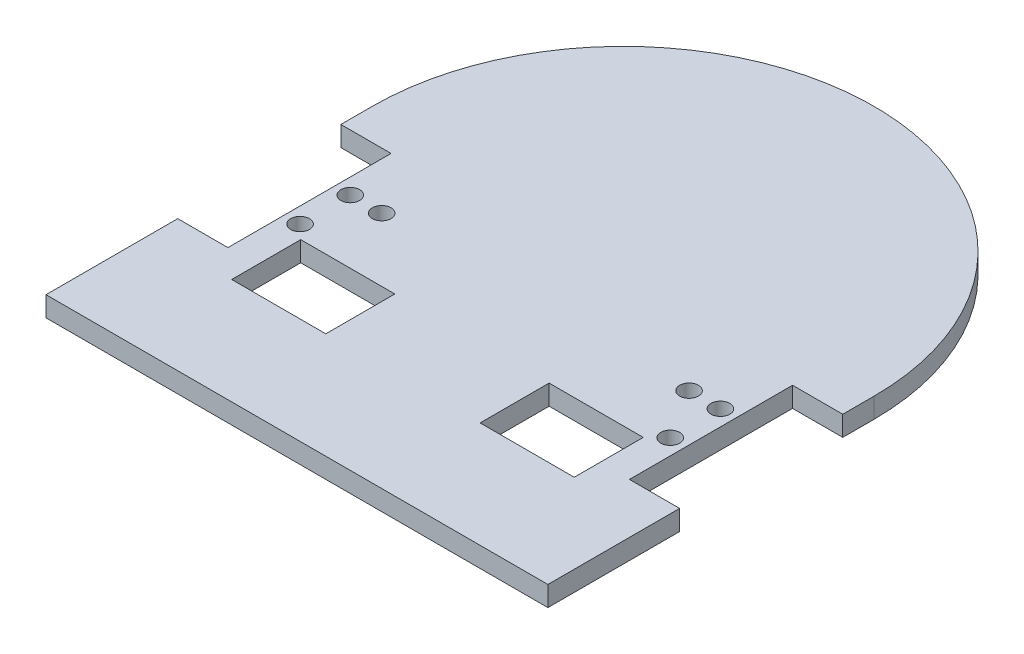
ISO-10303-21;
HEADER;
FILE_DESCRIPTION(('STEP AP214'),'2;1');
FILE_NAME('part.step','',(''),(''),'','','');
FILE_SCHEMA(('AUTOMOTIVE_DESIGN { 1 0 10303 214 1 1 1 1 }'));
ENDSEC;
DATA;
#1=APPLICATION_CONTEXT('core data for automotive mechanical design processes');
#2=APPLICATION_PROTOCOL_DEFINITION('international standard','automotive_design',2000,#1);
#3=PRODUCT_CONTEXT('',#1,'mechanical');
#4=PRODUCT('Part','Part','',(#3));
#5=PRODUCT_RELATED_PRODUCT_CATEGORY('part','',(#4));
#6=PRODUCT_DEFINITION_FORMATION('','',#4);
#7=PRODUCT_DEFINITION_CONTEXT('part definition',#1,'design');
#8=PRODUCT_DEFINITION('design','',#6,#7);
#9=PRODUCT_DEFINITION_SHAPE('','',#8);
#10=(LENGTH_UNIT() NAMED_UNIT(*) SI_UNIT(.MILLI.,.METRE.));
#11=(NAMED_UNIT(*) PLANE_ANGLE_UNIT() SI_UNIT($,.RADIAN.));
#12=(NAMED_UNIT(*) SI_UNIT($,.STERADIAN.) SOLID_ANGLE_UNIT());
#13=UNCERTAINTY_MEASURE_WITH_UNIT(LENGTH_MEASURE(1.E-05),#10,'distance_accuracy_value','');
#14=(GEOMETRIC_REPRESENTATION_CONTEXT(3) GLOBAL_UNCERTAINTY_ASSIGNED_CONTEXT((#13)) GLOBAL_UNIT_ASSIGNED_CONTEXT((#10,
#11,#12)) REPRESENTATION_CONTEXT('',''));
#15=CARTESIAN_POINT('',(0.,0.,0.));
#16=DIRECTION('',(0.,0.,1.));
#17=DIRECTION('',(1.,0.,0.));
#18=AXIS2_PLACEMENT_3D('',#15,#16,#17);
#19=CARTESIAN_POINT('',(0.,1.6,0.));
#20=DIRECTION('',(0.,1.,0.));
#21=DIRECTION('',(0.,0.,1.));
#22=AXIS2_PLACEMENT_3D('',#19,#20,#21);
#23=PLANE('',#22);
#24=CARTESIAN_POINT('',(14.75,1.6,11.));
#25=DIRECTION('',(0.,-1.,0.));
#26=DIRECTION('',(0.,0.,1.));
#27=AXIS2_PLACEMENT_3D('',#24,#25,#26);
#28=CIRCLE('',#27,0.75);
#29=CARTESIAN_POINT('',(14.75,1.6,11.75));
#30=VERTEX_POINT('',#29);
#31=EDGE_CURVE('E499',#30,#30,#28,.T.);
#32=ORIENTED_EDGE('',*,*,#31,.T.);
#33=EDGE_LOOP('',(#32));
#34=FACE_BOUND('',#33,.T.);
#35=CARTESIAN_POINT('',(12.25,1.6,7.));
#36=DIRECTION('',(0.,-1.,0.));
#37=DIRECTION('',(0.,0.,1.));
#38=AXIS2_PLACEMENT_3D('',#35,#36,#37);
#39=CIRCLE('',#38,0.75);
#40=CARTESIAN_POINT('',(12.25,1.6,7.75));
#41=VERTEX_POINT('',#40);
#42=EDGE_CURVE('E497',#41,#41,#39,.T.);
#43=ORIENTED_EDGE('',*,*,#42,.T.);
#44=EDGE_LOOP('',(#43));
#45=FACE_BOUND('',#44,.T.);
#46=CARTESIAN_POINT('',(14.75,1.6,7.));
#47=DIRECTION('',(0.,-1.,0.));
#48=DIRECTION('',(0.,0.,1.));
#49=AXIS2_PLACEMENT_3D('',#46,#47,#48);
#50=CIRCLE('',#49,0.75);
#51=CARTESIAN_POINT('',(14.75,1.6,7.75));
#52=VERTEX_POINT('',#51);
#53=EDGE_CURVE('E340',#52,#52,#50,.T.);
#54=ORIENTED_EDGE('',*,*,#53,.T.);
#55=EDGE_LOOP('',(#54));
#56=FACE_BOUND('',#55,.T.);
#57=CARTESIAN_POINT('',(-14.75,1.6,11.));
#58=DIRECTION('',(0.,1.,0.));
#59=DIRECTION('',(0.,0.,1.));
#60=AXIS2_PLACEMENT_3D('',#57,#58,#59);
#61=CIRCLE('',#60,0.75);
#62=CARTESIAN_POINT('',(-14.75,1.6,11.75));
#63=VERTEX_POINT('',#62);
#64=EDGE_CURVE('E345',#63,#63,#61,.T.);
#65=ORIENTED_EDGE('',*,*,#64,.F.);
#66=EDGE_LOOP('',(#65));
#67=FACE_BOUND('',#66,.T.);
#68=CARTESIAN_POINT('',(-12.25,1.6,7.));
#69=DIRECTION('',(0.,1.,0.));
#70=DIRECTION('',(0.,0.,1.));
#71=AXIS2_PLACEMENT_3D('',#68,#69,#70);
#72=CIRCLE('',#71,0.75);
#73=CARTESIAN_POINT('',(-12.25,1.6,7.75));
#74=VERTEX_POINT('',#73);
#75=EDGE_CURVE('E349',#74,#74,#72,.T.);
#76=ORIENTED_EDGE('',*,*,#75,.F.);
#77=EDGE_LOOP('',(#76));
#78=FACE_BOUND('',#77,.T.);
#79=CARTESIAN_POINT('',(-14.75,1.6,7.));
#80=DIRECTION('',(0.,1.,0.));
#81=DIRECTION('',(0.,0.,1.));
#82=AXIS2_PLACEMENT_3D('',#79,#80,#81);
#83=CIRCLE('',#82,0.75);
#84=CARTESIAN_POINT('',(-14.75,1.6,7.75));
#85=VERTEX_POINT('',#84);
#86=EDGE_CURVE('E331',#85,#85,#83,.T.);
#87=ORIENTED_EDGE('',*,*,#86,.F.);
#88=EDGE_LOOP('',(#87));
#89=FACE_BOUND('',#88,.T.);
#90=DIRECTION('',(1.,0.,0.));
#91=VECTOR('',#90,1.);
#92=CARTESIAN_POINT('',(-13.65,1.6,17.55));
#93=LINE('',#92,#91);
#94=CARTESIAN_POINT('',(-13.65,1.6,17.55));
#95=VERTEX_POINT('',#94);
#96=CARTESIAN_POINT('',(-6.15000000000001,1.6,17.55));
#97=VERTEX_POINT('',#96);
#98=EDGE_CURVE('E199',#95,#97,#93,.T.);
#99=ORIENTED_EDGE('',*,*,#98,.F.);
#100=DIRECTION('',(0.,0.,1.));
#101=VECTOR('',#100,1.);
#102=CARTESIAN_POINT('',(-13.65,1.6,12.05));
#103=LINE('',#102,#101);
#104=CARTESIAN_POINT('',(-13.65,1.6,12.05));
#105=VERTEX_POINT('',#104);
#106=EDGE_CURVE('E209',#105,#95,#103,.T.);
#107=ORIENTED_EDGE('',*,*,#106,.F.);
#108=DIRECTION('',(1.,0.,0.));
#109=VECTOR('',#108,1.);
#110=CARTESIAN_POINT('',(-13.65,1.6,12.05));
#111=LINE('',#110,#109);
#112=CARTESIAN_POINT('',(-6.15000000000001,1.6,12.05));
#113=VERTEX_POINT('',#112);
#114=EDGE_CURVE('E206',#105,#113,#111,.T.);
#115=ORIENTED_EDGE('',*,*,#114,.T.);
#116=DIRECTION('',(0.,0.,1.));
#117=VECTOR('',#116,1.);
#118=CARTESIAN_POINT('',(-6.15000000000001,1.6,12.05));
#119=LINE('',#118,#117);
#120=EDGE_CURVE('E203',#113,#97,#119,.T.);
#121=ORIENTED_EDGE('',*,*,#120,.T.);
#122=EDGE_LOOP('',(#99,#107,#115,#121));
#123=FACE_BOUND('',#122,.T.);
#124=DIRECTION('',(0.,0.,1.));
#125=VECTOR('',#124,1.);
#126=CARTESIAN_POINT('',(-20.,1.6,0.));
#127=LINE('',#126,#125);
#128=CARTESIAN_POINT('',(-20.,1.6,0.));
#129=VERTEX_POINT('',#128);
#130=CARTESIAN_POINT('',(-20.,1.6,2.5));
#131=VERTEX_POINT('',#130);
#132=EDGE_CURVE('E266',#129,#131,#127,.T.);
#133=ORIENTED_EDGE('',*,*,#132,.T.);
#134=DIRECTION('',(1.,0.,0.));
#135=VECTOR('',#134,1.);
#136=CARTESIAN_POINT('',(0.,1.6,2.50000000000001));
#137=LINE('',#136,#135);
#138=CARTESIAN_POINT('',(-16.,1.6,2.5));
#139=VERTEX_POINT('',#138);
#140=EDGE_CURVE('E255',#131,#139,#137,.T.);
#141=ORIENTED_EDGE('',*,*,#140,.T.);
#142=DIRECTION('',(0.,0.,1.));
#143=VECTOR('',#142,1.);
#144=CARTESIAN_POINT('',(-16.,1.6,0.));
#145=LINE('',#144,#143);
#146=CARTESIAN_POINT('',(-16.,1.6,15.5));
#147=VERTEX_POINT('',#146);
#148=EDGE_CURVE('E252',#139,#147,#145,.T.);
#149=ORIENTED_EDGE('',*,*,#148,.T.);
#150=DIRECTION('',(-1.,0.,0.));
#151=VECTOR('',#150,1.);
#152=CARTESIAN_POINT('',(0.,1.6,15.5));
#153=LINE('',#152,#151);
#154=CARTESIAN_POINT('',(-20.,1.6,15.5));
#155=VERTEX_POINT('',#154);
#156=EDGE_CURVE('E249',#147,#155,#153,.T.);
#157=ORIENTED_EDGE('',*,*,#156,.T.);
#158=CARTESIAN_POINT('',(-20.,1.6,26.));
#159=VERTEX_POINT('',#158);
#160=EDGE_CURVE('E265',#155,#159,#127,.T.);
#161=ORIENTED_EDGE('',*,*,#160,.T.);
#162=DIRECTION('',(1.,0.,0.));
#163=VECTOR('',#162,1.);
#164=CARTESIAN_POINT('',(0.,1.6,26.));
#165=LINE('',#164,#163);
#166=CARTESIAN_POINT('',(20.,1.6,26.));
#167=VERTEX_POINT('',#166);
#168=EDGE_CURVE('E269',#159,#167,#165,.T.);
#169=ORIENTED_EDGE('',*,*,#168,.T.);
#170=DIRECTION('',(0.,0.,1.));
#171=VECTOR('',#170,1.);
#172=CARTESIAN_POINT('',(20.,1.6,0.));
#173=LINE('',#172,#171);
#174=CARTESIAN_POINT('',(20.,1.6,15.5));
#175=VERTEX_POINT('',#174);
#176=EDGE_CURVE('E263',#175,#167,#173,.T.);
#177=ORIENTED_EDGE('',*,*,#176,.F.);
#178=DIRECTION('',(1.,0.,0.));
#179=VECTOR('',#178,1.);
#180=CARTESIAN_POINT('',(0.,1.6,15.5));
#181=LINE('',#180,#179);
#182=CARTESIAN_POINT('',(16.,1.6,15.5));
#183=VERTEX_POINT('',#182);
#184=EDGE_CURVE('E247',#183,#175,#181,.T.);
#185=ORIENTED_EDGE('',*,*,#184,.F.);
#186=DIRECTION('',(0.,0.,1.));
#187=VECTOR('',#186,1.);
#188=CARTESIAN_POINT('',(16.,1.6,0.));
#189=LINE('',#188,#187);
#190=CARTESIAN_POINT('',(16.,1.6,2.5));
#191=VERTEX_POINT('',#190);
#192=EDGE_CURVE('E245',#191,#183,#189,.T.);
#193=ORIENTED_EDGE('',*,*,#192,.F.);
#194=DIRECTION('',(-1.,0.,0.));
#195=VECTOR('',#194,1.);
#196=CARTESIAN_POINT('',(0.,1.6,2.50000000000001));
#197=LINE('',#196,#195);
#198=CARTESIAN_POINT('',(20.,1.6,2.5));
#199=VERTEX_POINT('',#198);
#200=EDGE_CURVE('E225',#199,#191,#197,.T.);
#201=ORIENTED_EDGE('',*,*,#200,.F.);
#202=CARTESIAN_POINT('',(20.,1.6,0.));
#203=VERTEX_POINT('',#202);
#204=EDGE_CURVE('E259',#203,#199,#173,.T.);
#205=ORIENTED_EDGE('',*,*,#204,.F.);
#206=CARTESIAN_POINT('',(0.,1.6,0.));
#207=DIRECTION('',(0.,1.,0.));
#208=DIRECTION('',(0.,0.,1.));
#209=AXIS2_PLACEMENT_3D('',#206,#207,#208);
#210=CIRCLE('',#209,20.);
#211=EDGE_CURVE('E262',#203,#129,#210,.T.);
#212=ORIENTED_EDGE('',*,*,#211,.T.);
#213=EDGE_LOOP('',(#133,#141,#149,#157,#161,#169,#177,#185,#193,#201,#205,#212));
#214=FACE_BOUND('',#213,.T.);
#215=DIRECTION('',(0.,0.,1.));
#216=VECTOR('',#215,1.);
#217=CARTESIAN_POINT('',(13.65,1.6,12.05));
#218=LINE('',#217,#216);
#219=CARTESIAN_POINT('',(13.65,1.6,12.05));
#220=VERTEX_POINT('',#219);
#221=CARTESIAN_POINT('',(13.65,1.6,17.55));
#222=VERTEX_POINT('',#221);
#223=EDGE_CURVE('E187',#220,#222,#218,.T.);
#224=ORIENTED_EDGE('',*,*,#223,.T.);
#225=DIRECTION('',(-1.,0.,0.));
#226=VECTOR('',#225,1.);
#227=CARTESIAN_POINT('',(13.65,1.6,17.55));
#228=LINE('',#227,#226);
#229=CARTESIAN_POINT('',(6.15000000000001,1.6,17.55));
#230=VERTEX_POINT('',#229);
#231=EDGE_CURVE('E54',#222,#230,#228,.T.);
#232=ORIENTED_EDGE('',*,*,#231,.T.);
#233=DIRECTION('',(0.,0.,1.));
#234=VECTOR('',#233,1.);
#235=CARTESIAN_POINT('',(6.15000000000001,1.6,12.05));
#236=LINE('',#235,#234);
#237=CARTESIAN_POINT('',(6.15000000000001,1.6,12.05));
#238=VERTEX_POINT('',#237);
#239=EDGE_CURVE('E192',#238,#230,#236,.T.);
#240=ORIENTED_EDGE('',*,*,#239,.F.);
#241=DIRECTION('',(-1.,0.,0.));
#242=VECTOR('',#241,1.);
#243=CARTESIAN_POINT('',(13.65,1.6,12.05));
#244=LINE('',#243,#242);
#245=EDGE_CURVE('E178',#220,#238,#244,.T.);
#246=ORIENTED_EDGE('',*,*,#245,.F.);
#247=EDGE_LOOP('',(#224,#232,#240,#246));
#248=FACE_BOUND('',#247,.T.);
#249=ADVANCED_FACE('F37',(#34,#45,#56,#67,#78,#89,#123,#214,#248),#23,.T.);
#250=CARTESIAN_POINT('',(0.,0.,0.));
#251=DIRECTION('',(0.,1.,0.));
#252=DIRECTION('',(0.,0.,1.));
#253=AXIS2_PLACEMENT_3D('',#250,#251,#252);
#254=PLANE('',#253);
#255=CARTESIAN_POINT('',(14.75,0.,11.));
#256=DIRECTION('',(0.,1.,0.));
#257=DIRECTION('',(0.,0.,1.));
#258=AXIS2_PLACEMENT_3D('',#255,#256,#257);
#259=CIRCLE('',#258,0.75);
#260=CARTESIAN_POINT('',(14.75,0.,11.75));
#261=VERTEX_POINT('',#260);
#262=EDGE_CURVE('E41',#261,#261,#259,.F.);
#263=ORIENTED_EDGE('',*,*,#262,.F.);
#264=EDGE_LOOP('',(#263));
#265=FACE_BOUND('',#264,.T.);
#266=CARTESIAN_POINT('',(12.25,0.,7.));
#267=DIRECTION('',(0.,1.,0.));
#268=DIRECTION('',(0.,0.,1.));
#269=AXIS2_PLACEMENT_3D('',#266,#267,#268);
#270=CIRCLE('',#269,0.75);
#271=CARTESIAN_POINT('',(12.25,0.,7.75));
#272=VERTEX_POINT('',#271);
#273=EDGE_CURVE('E339',#272,#272,#270,.F.);
#274=ORIENTED_EDGE('',*,*,#273,.F.);
#275=EDGE_LOOP('',(#274));
#276=FACE_BOUND('',#275,.T.);
#277=CARTESIAN_POINT('',(14.75,0.,7.));
#278=DIRECTION('',(0.,1.,0.));
#279=DIRECTION('',(0.,0.,1.));
#280=AXIS2_PLACEMENT_3D('',#277,#278,#279);
#281=CIRCLE('',#280,0.75);
#282=CARTESIAN_POINT('',(14.75,0.,7.75));
#283=VERTEX_POINT('',#282);
#284=EDGE_CURVE('E337',#283,#283,#281,.F.);
#285=ORIENTED_EDGE('',*,*,#284,.F.);
#286=EDGE_LOOP('',(#285));
#287=FACE_BOUND('',#286,.T.);
#288=CARTESIAN_POINT('',(-14.75,0.,11.));
#289=DIRECTION('',(0.,1.,0.));
#290=DIRECTION('',(0.,0.,1.));
#291=AXIS2_PLACEMENT_3D('',#288,#289,#290);
#292=CIRCLE('',#291,0.75);
#293=CARTESIAN_POINT('',(-14.75,0.,11.75));
#294=VERTEX_POINT('',#293);
#295=EDGE_CURVE('E334',#294,#294,#292,.T.);
#296=ORIENTED_EDGE('',*,*,#295,.T.);
#297=EDGE_LOOP('',(#296));
#298=FACE_BOUND('',#297,.T.);
#299=CARTESIAN_POINT('',(-12.25,0.,7.));
#300=DIRECTION('',(0.,1.,0.));
#301=DIRECTION('',(0.,0.,1.));
#302=AXIS2_PLACEMENT_3D('',#299,#300,#301);
#303=CIRCLE('',#302,0.75);
#304=CARTESIAN_POINT('',(-12.25,0.,7.75));
#305=VERTEX_POINT('',#304);
#306=EDGE_CURVE('E330',#305,#305,#303,.T.);
#307=ORIENTED_EDGE('',*,*,#306,.T.);
#308=EDGE_LOOP('',(#307));
#309=FACE_BOUND('',#308,.T.);
#310=CARTESIAN_POINT('',(-14.75,0.,7.));
#311=DIRECTION('',(0.,1.,0.));
#312=DIRECTION('',(0.,0.,1.));
#313=AXIS2_PLACEMENT_3D('',#310,#311,#312);
#314=CIRCLE('',#313,0.75);
#315=CARTESIAN_POINT('',(-14.75,0.,7.75));
#316=VERTEX_POINT('',#315);
#317=EDGE_CURVE('E327',#316,#316,#314,.T.);
#318=ORIENTED_EDGE('',*,*,#317,.T.);
#319=EDGE_LOOP('',(#318));
#320=FACE_BOUND('',#319,.T.);
#321=DIRECTION('',(1.,0.,0.));
#322=VECTOR('',#321,1.);
#323=CARTESIAN_POINT('',(0.,0.,2.50000000000001));
#324=LINE('',#323,#322);
#325=CARTESIAN_POINT('',(-20.,0.,2.5));
#326=VERTEX_POINT('',#325);
#327=CARTESIAN_POINT('',(-16.,0.,2.5));
#328=VERTEX_POINT('',#327);
#329=EDGE_CURVE('E309',#326,#328,#324,.T.);
#330=ORIENTED_EDGE('',*,*,#329,.F.);
#331=DIRECTION('',(0.,0.,1.));
#332=VECTOR('',#331,1.);
#333=CARTESIAN_POINT('',(-20.,0.,0.));
#334=LINE('',#333,#332);
#335=CARTESIAN_POINT('',(-20.,0.,0.));
#336=VERTEX_POINT('',#335);
#337=EDGE_CURVE('E279',#336,#326,#334,.T.);
#338=ORIENTED_EDGE('',*,*,#337,.F.);
#339=CARTESIAN_POINT('',(0.,0.,0.));
#340=DIRECTION('',(0.,1.,0.));
#341=DIRECTION('',(0.,0.,1.));
#342=AXIS2_PLACEMENT_3D('',#339,#340,#341);
#343=CIRCLE('',#342,20.);
#344=CARTESIAN_POINT('',(20.,0.,0.));
#345=VERTEX_POINT('',#344);
#346=EDGE_CURVE('E276',#345,#336,#343,.T.);
#347=ORIENTED_EDGE('',*,*,#346,.F.);
#348=DIRECTION('',(0.,0.,1.));
#349=VECTOR('',#348,1.);
#350=CARTESIAN_POINT('',(20.,0.,0.));
#351=LINE('',#350,#349);
#352=CARTESIAN_POINT('',(20.,0.,2.5));
#353=VERTEX_POINT('',#352);
#354=EDGE_CURVE('E273',#345,#353,#351,.T.);
#355=ORIENTED_EDGE('',*,*,#354,.T.);
#356=DIRECTION('',(-1.,0.,0.));
#357=VECTOR('',#356,1.);
#358=CARTESIAN_POINT('',(0.,0.,2.50000000000001));
#359=LINE('',#358,#357);
#360=CARTESIAN_POINT('',(16.,0.,2.5));
#361=VERTEX_POINT('',#360);
#362=EDGE_CURVE('E295',#353,#361,#359,.T.);
#363=ORIENTED_EDGE('',*,*,#362,.T.);
#364=DIRECTION('',(0.,0.,1.));
#365=VECTOR('',#364,1.);
#366=CARTESIAN_POINT('',(16.,0.,0.));
#367=LINE('',#366,#365);
#368=CARTESIAN_POINT('',(16.,0.,15.5));
#369=VERTEX_POINT('',#368);
#370=EDGE_CURVE('E298',#361,#369,#367,.T.);
#371=ORIENTED_EDGE('',*,*,#370,.T.);
#372=DIRECTION('',(1.,0.,0.));
#373=VECTOR('',#372,1.);
#374=CARTESIAN_POINT('',(0.,0.,15.5));
#375=LINE('',#374,#373);
#376=CARTESIAN_POINT('',(20.,0.,15.5));
#377=VERTEX_POINT('',#376);
#378=EDGE_CURVE('E301',#369,#377,#375,.T.);
#379=ORIENTED_EDGE('',*,*,#378,.T.);
#380=CARTESIAN_POINT('',(20.,0.,26.));
#381=VERTEX_POINT('',#380);
#382=EDGE_CURVE('E258',#377,#381,#351,.T.);
#383=ORIENTED_EDGE('',*,*,#382,.T.);
#384=DIRECTION('',(1.,0.,0.));
#385=VECTOR('',#384,1.);
#386=CARTESIAN_POINT('',(0.,0.,26.));
#387=LINE('',#386,#385);
#388=CARTESIAN_POINT('',(-20.,0.,26.));
#389=VERTEX_POINT('',#388);
#390=EDGE_CURVE('E282',#389,#381,#387,.T.);
#391=ORIENTED_EDGE('',*,*,#390,.F.);
#392=CARTESIAN_POINT('',(-20.,0.,15.5));
#393=VERTEX_POINT('',#392);
#394=EDGE_CURVE('E278',#393,#389,#334,.T.);
#395=ORIENTED_EDGE('',*,*,#394,.F.);
#396=DIRECTION('',(-1.,0.,0.));
#397=VECTOR('',#396,1.);
#398=CARTESIAN_POINT('',(0.,0.,15.5));
#399=LINE('',#398,#397);
#400=CARTESIAN_POINT('',(-16.,0.,15.5));
#401=VERTEX_POINT('',#400);
#402=EDGE_CURVE('E304',#401,#393,#399,.T.);
#403=ORIENTED_EDGE('',*,*,#402,.F.);
#404=DIRECTION('',(0.,0.,1.));
#405=VECTOR('',#404,1.);
#406=CARTESIAN_POINT('',(-16.,0.,0.));
#407=LINE('',#406,#405);
#408=EDGE_CURVE('E306',#328,#401,#407,.T.);
#409=ORIENTED_EDGE('',*,*,#408,.F.);
#410=EDGE_LOOP('',(#330,#338,#347,#355,#363,#371,#379,#383,#391,#395,#403,#409));
#411=FACE_BOUND('',#410,.T.);
#412=DIRECTION('',(0.,0.,1.));
#413=VECTOR('',#412,1.);
#414=CARTESIAN_POINT('',(-13.65,0.,0.));
#415=LINE('',#414,#413);
#416=CARTESIAN_POINT('',(-13.65,0.,12.05));
#417=VERTEX_POINT('',#416);
#418=CARTESIAN_POINT('',(-13.65,0.,17.55));
#419=VERTEX_POINT('',#418);
#420=EDGE_CURVE('E316',#417,#419,#415,.T.);
#421=ORIENTED_EDGE('',*,*,#420,.T.);
#422=DIRECTION('',(1.,0.,0.));
#423=VECTOR('',#422,1.);
#424=CARTESIAN_POINT('',(0.,0.,17.55));
#425=LINE('',#424,#423);
#426=CARTESIAN_POINT('',(-6.15000000000001,0.,17.55));
#427=VERTEX_POINT('',#426);
#428=EDGE_CURVE('E319',#419,#427,#425,.T.);
#429=ORIENTED_EDGE('',*,*,#428,.T.);
#430=DIRECTION('',(0.,0.,1.));
#431=VECTOR('',#430,1.);
#432=CARTESIAN_POINT('',(-6.15000000000001,0.,0.));
#433=LINE('',#432,#431);
#434=CARTESIAN_POINT('',(-6.15000000000001,0.,12.05));
#435=VERTEX_POINT('',#434);
#436=EDGE_CURVE('E311',#435,#427,#433,.T.);
#437=ORIENTED_EDGE('',*,*,#436,.F.);
#438=DIRECTION('',(1.,0.,0.));
#439=VECTOR('',#438,1.);
#440=CARTESIAN_POINT('',(0.,0.,12.05));
#441=LINE('',#440,#439);
#442=EDGE_CURVE('E313',#417,#435,#441,.T.);
#443=ORIENTED_EDGE('',*,*,#442,.F.);
#444=EDGE_LOOP('',(#421,#429,#437,#443));
#445=FACE_BOUND('',#444,.T.);
#446=DIRECTION('',(-1.,0.,0.));
#447=VECTOR('',#446,1.);
#448=CARTESIAN_POINT('',(0.,0.,17.55));
#449=LINE('',#448,#447);
#450=CARTESIAN_POINT('',(13.65,0.,17.55));
#451=VERTEX_POINT('',#450);
#452=CARTESIAN_POINT('',(6.15000000000001,0.,17.55));
#453=VERTEX_POINT('',#452);
#454=EDGE_CURVE('E11',#451,#453,#449,.T.);
#455=ORIENTED_EDGE('',*,*,#454,.F.);
#456=DIRECTION('',(0.,0.,1.));
#457=VECTOR('',#456,1.);
#458=CARTESIAN_POINT('',(13.65,0.,0.));
#459=LINE('',#458,#457);
#460=CARTESIAN_POINT('',(13.65,0.,12.05));
#461=VERTEX_POINT('',#460);
#462=EDGE_CURVE('E322',#461,#451,#459,.T.);
#463=ORIENTED_EDGE('',*,*,#462,.F.);
#464=DIRECTION('',(-1.,0.,0.));
#465=VECTOR('',#464,1.);
#466=CARTESIAN_POINT('',(0.,0.,12.05));
#467=LINE('',#466,#465);
#468=CARTESIAN_POINT('',(6.15000000000001,0.,12.05));
#469=VERTEX_POINT('',#468);
#470=EDGE_CURVE('E181',#461,#469,#467,.T.);
#471=ORIENTED_EDGE('',*,*,#470,.T.);
#472=DIRECTION('',(0.,0.,1.));
#473=VECTOR('',#472,1.);
#474=CARTESIAN_POINT('',(6.15000000000001,0.,0.));
#475=LINE('',#474,#473);
#476=EDGE_CURVE('E46',#469,#453,#475,.T.);
#477=ORIENTED_EDGE('',*,*,#476,.T.);
#478=EDGE_LOOP('',(#455,#463,#471,#477));
#479=FACE_BOUND('',#478,.T.);
#480=ADVANCED_FACE('F365',(#265,#276,#287,#298,#309,#320,#411,#445,#479),#254,.F.);
#481=CARTESIAN_POINT('',(20.,1.6,0.));
#482=DIRECTION('',(1.,0.,0.));
#483=DIRECTION('',(0.,0.,-1.));
#484=AXIS2_PLACEMENT_3D('',#481,#482,#483);
#485=PLANE('',#484);
#486=DIRECTION('',(0.,1.,0.));
#487=VECTOR('',#486,1.);
#488=CARTESIAN_POINT('',(20.,-7.,15.5));
#489=LINE('',#488,#487);
#490=EDGE_CURVE('E215',#377,#175,#489,.T.);
#491=ORIENTED_EDGE('',*,*,#490,.T.);
#492=ORIENTED_EDGE('',*,*,#176,.T.);
#493=DIRECTION('',(0.,-1.,0.));
#494=VECTOR('',#493,1.);
#495=CARTESIAN_POINT('',(20.,1.6,26.));
#496=LINE('',#495,#494);
#497=EDGE_CURVE('E272',#167,#381,#496,.T.);
#498=ORIENTED_EDGE('',*,*,#497,.T.);
#499=ORIENTED_EDGE('',*,*,#382,.F.);
#500=EDGE_LOOP('',(#491,#492,#498,#499));
#501=FACE_BOUND('',#500,.T.);
#502=ADVANCED_FACE('F405',(#501),#485,.T.);
#503=CARTESIAN_POINT('',(-20.,1.6,0.));
#504=DIRECTION('',(1.,0.,0.));
#505=DIRECTION('',(0.,0.,-1.));
#506=AXIS2_PLACEMENT_3D('',#503,#504,#505);
#507=PLANE('',#506);
#508=DIRECTION('',(0.,1.,0.));
#509=VECTOR('',#508,1.);
#510=CARTESIAN_POINT('',(-20.,-7.,2.5));
#511=LINE('',#510,#509);
#512=EDGE_CURVE('E222',#326,#131,#511,.T.);
#513=ORIENTED_EDGE('',*,*,#512,.T.);
#514=ORIENTED_EDGE('',*,*,#132,.F.);
#515=DIRECTION('',(0.,-1.,0.));
#516=VECTOR('',#515,1.);
#517=CARTESIAN_POINT('',(-20.,1.6,0.));
#518=LINE('',#517,#516);
#519=EDGE_CURVE('E290',#129,#336,#518,.T.);
#520=ORIENTED_EDGE('',*,*,#519,.T.);
#521=ORIENTED_EDGE('',*,*,#337,.T.);
#522=EDGE_LOOP('',(#513,#514,#520,#521));
#523=FACE_BOUND('',#522,.T.);
#524=ADVANCED_FACE('F376',(#523),#507,.F.);
#525=DIRECTION('',(0.,1.,0.));
#526=VECTOR('',#525,1.);
#527=CARTESIAN_POINT('',(-20.,-7.,15.5));
#528=LINE('',#527,#526);
#529=EDGE_CURVE('E232',#393,#155,#528,.T.);
#530=ORIENTED_EDGE('',*,*,#529,.F.);
#531=ORIENTED_EDGE('',*,*,#394,.T.);
#532=DIRECTION('',(0.,-1.,0.));
#533=VECTOR('',#532,1.);
#534=CARTESIAN_POINT('',(-20.,1.6,26.));
#535=LINE('',#534,#533);
#536=EDGE_CURVE('E287',#159,#389,#535,.T.);
#537=ORIENTED_EDGE('',*,*,#536,.F.);
#538=ORIENTED_EDGE('',*,*,#160,.F.);
#539=EDGE_LOOP('',(#530,#531,#537,#538));
#540=FACE_BOUND('',#539,.T.);
#541=ADVANCED_FACE('F395',(#540),#507,.F.);
#542=DIRECTION('',(0.,1.,0.));
#543=VECTOR('',#542,1.);
#544=CARTESIAN_POINT('',(20.,-7.,2.5));
#545=LINE('',#544,#543);
#546=EDGE_CURVE('E240',#353,#199,#545,.T.);
#547=ORIENTED_EDGE('',*,*,#546,.F.);
#548=ORIENTED_EDGE('',*,*,#354,.F.);
#549=DIRECTION('',(0.,-1.,0.));
#550=VECTOR('',#549,1.);
#551=CARTESIAN_POINT('',(20.,1.6,0.));
#552=LINE('',#551,#550);
#553=EDGE_CURVE('E293',#203,#345,#552,.T.);
#554=ORIENTED_EDGE('',*,*,#553,.F.);
#555=ORIENTED_EDGE('',*,*,#204,.T.);
#556=EDGE_LOOP('',(#547,#548,#554,#555));
#557=FACE_BOUND('',#556,.T.);
#558=ADVANCED_FACE('F39',(#557),#485,.T.);
#559=CARTESIAN_POINT('',(0.,1.6,0.));
#560=DIRECTION('',(0.,-1.,0.));
#561=DIRECTION('',(0.,0.,-1.));
#562=AXIS2_PLACEMENT_3D('',#559,#560,#561);
#563=CYLINDRICAL_SURFACE('',#562,20.);
#564=ORIENTED_EDGE('',*,*,#346,.T.);
#565=ORIENTED_EDGE('',*,*,#519,.F.);
#566=ORIENTED_EDGE('',*,*,#211,.F.);
#567=ORIENTED_EDGE('',*,*,#553,.T.);
#568=EDGE_LOOP('',(#564,#565,#566,#567));
#569=FACE_BOUND('',#568,.T.);
#570=ADVANCED_FACE('F419',(#569),#563,.T.);
#571=CARTESIAN_POINT('',(0.,1.6,26.));
#572=DIRECTION('',(0.,0.,-1.));
#573=DIRECTION('',(-1.,0.,0.));
#574=AXIS2_PLACEMENT_3D('',#571,#572,#573);
#575=PLANE('',#574);
#576=ORIENTED_EDGE('',*,*,#390,.T.);
#577=ORIENTED_EDGE('',*,*,#497,.F.);
#578=ORIENTED_EDGE('',*,*,#168,.F.);
#579=ORIENTED_EDGE('',*,*,#536,.T.);
#580=EDGE_LOOP('',(#576,#577,#578,#579));
#581=FACE_BOUND('',#580,.T.);
#582=ADVANCED_FACE('F400',(#581),#575,.F.);
#583=CARTESIAN_POINT('',(0.,-7.,15.5));
#584=DIRECTION('',(0.,0.,1.));
#585=DIRECTION('',(1.,0.,0.));
#586=AXIS2_PLACEMENT_3D('',#583,#584,#585);
#587=PLANE('',#586);
#588=ORIENTED_EDGE('',*,*,#184,.T.);
#589=ORIENTED_EDGE('',*,*,#490,.F.);
#590=ORIENTED_EDGE('',*,*,#378,.F.);
#591=DIRECTION('',(0.,1.,0.));
#592=VECTOR('',#591,1.);
#593=CARTESIAN_POINT('',(16.,-7.,15.5));
#594=LINE('',#593,#592);
#595=EDGE_CURVE('E234',#369,#183,#594,.T.);
#596=ORIENTED_EDGE('',*,*,#595,.T.);
#597=EDGE_LOOP('',(#588,#589,#590,#596));
#598=FACE_BOUND('',#597,.T.);
#599=ADVANCED_FACE('F408',(#598),#587,.F.);
#600=CARTESIAN_POINT('',(16.,-7.,0.));
#601=DIRECTION('',(-1.,0.,0.));
#602=DIRECTION('',(0.,0.,1.));
#603=AXIS2_PLACEMENT_3D('',#600,#601,#602);
#604=PLANE('',#603);
#605=ORIENTED_EDGE('',*,*,#192,.T.);
#606=ORIENTED_EDGE('',*,*,#595,.F.);
#607=ORIENTED_EDGE('',*,*,#370,.F.);
#608=DIRECTION('',(0.,1.,0.));
#609=VECTOR('',#608,1.);
#610=CARTESIAN_POINT('',(16.,-7.,2.5));
#611=LINE('',#610,#609);
#612=EDGE_CURVE('E237',#361,#191,#611,.T.);
#613=ORIENTED_EDGE('',*,*,#612,.T.);
#614=EDGE_LOOP('',(#605,#606,#607,#613));
#615=FACE_BOUND('',#614,.T.);
#616=ADVANCED_FACE('F412',(#615),#604,.F.);
#617=CARTESIAN_POINT('',(0.,-7.,2.50000000000001));
#618=DIRECTION('',(0.,0.,-1.));
#619=DIRECTION('',(-1.,0.,0.));
#620=AXIS2_PLACEMENT_3D('',#617,#618,#619);
#621=PLANE('',#620);
#622=ORIENTED_EDGE('',*,*,#200,.T.);
#623=ORIENTED_EDGE('',*,*,#612,.F.);
#624=ORIENTED_EDGE('',*,*,#362,.F.);
#625=ORIENTED_EDGE('',*,*,#546,.T.);
#626=EDGE_LOOP('',(#622,#623,#624,#625));
#627=FACE_BOUND('',#626,.T.);
#628=ADVANCED_FACE('F434',(#627),#621,.F.);
#629=CARTESIAN_POINT('',(0.,-7.,2.50000000000001));
#630=DIRECTION('',(0.,0.,1.));
#631=DIRECTION('',(1.,0.,0.));
#632=AXIS2_PLACEMENT_3D('',#629,#630,#631);
#633=PLANE('',#632);
#634=ORIENTED_EDGE('',*,*,#512,.F.);
#635=ORIENTED_EDGE('',*,*,#329,.T.);
#636=DIRECTION('',(0.,1.,0.));
#637=VECTOR('',#636,1.);
#638=CARTESIAN_POINT('',(-16.,-7.,2.5));
#639=LINE('',#638,#637);
#640=EDGE_CURVE('E226',#328,#139,#639,.T.);
#641=ORIENTED_EDGE('',*,*,#640,.T.);
#642=ORIENTED_EDGE('',*,*,#140,.F.);
#643=EDGE_LOOP('',(#634,#635,#641,#642));
#644=FACE_BOUND('',#643,.T.);
#645=ADVANCED_FACE('F380',(#644),#633,.T.);
#646=CARTESIAN_POINT('',(-16.,-7.,0.));
#647=DIRECTION('',(-1.,0.,0.));
#648=DIRECTION('',(0.,0.,1.));
#649=AXIS2_PLACEMENT_3D('',#646,#647,#648);
#650=PLANE('',#649);
#651=ORIENTED_EDGE('',*,*,#640,.F.);
#652=ORIENTED_EDGE('',*,*,#408,.T.);
#653=DIRECTION('',(0.,1.,0.));
#654=VECTOR('',#653,1.);
#655=CARTESIAN_POINT('',(-16.,-7.,15.5));
#656=LINE('',#655,#654);
#657=EDGE_CURVE('E229',#401,#147,#656,.T.);
#658=ORIENTED_EDGE('',*,*,#657,.T.);
#659=ORIENTED_EDGE('',*,*,#148,.F.);
#660=EDGE_LOOP('',(#651,#652,#658,#659));
#661=FACE_BOUND('',#660,.T.);
#662=ADVANCED_FACE('F389',(#661),#650,.T.);
#663=CARTESIAN_POINT('',(0.,-7.,15.5));
#664=DIRECTION('',(0.,0.,-1.));
#665=DIRECTION('',(-1.,0.,0.));
#666=AXIS2_PLACEMENT_3D('',#663,#664,#665);
#667=PLANE('',#666);
#668=ORIENTED_EDGE('',*,*,#657,.F.);
#669=ORIENTED_EDGE('',*,*,#402,.T.);
#670=ORIENTED_EDGE('',*,*,#529,.T.);
#671=ORIENTED_EDGE('',*,*,#156,.F.);
#672=EDGE_LOOP('',(#668,#669,#670,#671));
#673=FACE_BOUND('',#672,.T.);
#674=ADVANCED_FACE('F439',(#673),#667,.T.);
#675=CARTESIAN_POINT('',(-13.65,-8.4,17.55));
#676=DIRECTION('',(0.,0.,1.));
#677=DIRECTION('',(1.,0.,0.));
#678=AXIS2_PLACEMENT_3D('',#675,#676,#677);
#679=PLANE('',#678);
#680=DIRECTION('',(0.,1.,0.));
#681=VECTOR('',#680,1.);
#682=CARTESIAN_POINT('',(-13.65,-8.4,17.55));
#683=LINE('',#682,#681);
#684=EDGE_CURVE('E213',#419,#95,#683,.T.);
#685=ORIENTED_EDGE('',*,*,#684,.T.);
#686=ORIENTED_EDGE('',*,*,#98,.T.);
#687=DIRECTION('',(0.,1.,0.));
#688=VECTOR('',#687,1.);
#689=CARTESIAN_POINT('',(-6.15000000000001,-8.4,17.55));
#690=LINE('',#689,#688);
#691=EDGE_CURVE('E212',#427,#97,#690,.T.);
#692=ORIENTED_EDGE('',*,*,#691,.F.);
#693=ORIENTED_EDGE('',*,*,#428,.F.);
#694=EDGE_LOOP('',(#685,#686,#692,#693));
#695=FACE_BOUND('',#694,.T.);
#696=ADVANCED_FACE('F442',(#695),#679,.F.);
#697=CARTESIAN_POINT('',(-13.65,-8.4,12.05));
#698=DIRECTION('',(-1.,0.,0.));
#699=DIRECTION('',(0.,0.,1.));
#700=AXIS2_PLACEMENT_3D('',#697,#698,#699);
#701=PLANE('',#700);
#702=DIRECTION('',(0.,1.,0.));
#703=VECTOR('',#702,1.);
#704=CARTESIAN_POINT('',(-13.65,-8.4,12.05));
#705=LINE('',#704,#703);
#706=EDGE_CURVE('E216',#417,#105,#705,.T.);
#707=ORIENTED_EDGE('',*,*,#706,.T.);
#708=ORIENTED_EDGE('',*,*,#106,.T.);
#709=ORIENTED_EDGE('',*,*,#684,.F.);
#710=ORIENTED_EDGE('',*,*,#420,.F.);
#711=EDGE_LOOP('',(#707,#708,#709,#710));
#712=FACE_BOUND('',#711,.T.);
#713=ADVANCED_FACE('F449',(#712),#701,.F.);
#714=CARTESIAN_POINT('',(-13.65,-8.4,12.05));
#715=DIRECTION('',(0.,0.,1.));
#716=DIRECTION('',(1.,0.,0.));
#717=AXIS2_PLACEMENT_3D('',#714,#715,#716);
#718=PLANE('',#717);
#719=ORIENTED_EDGE('',*,*,#442,.T.);
#720=DIRECTION('',(0.,1.,0.));
#721=VECTOR('',#720,1.);
#722=CARTESIAN_POINT('',(-6.15000000000001,-8.4,12.05));
#723=LINE('',#722,#721);
#724=EDGE_CURVE('E218',#435,#113,#723,.T.);
#725=ORIENTED_EDGE('',*,*,#724,.T.);
#726=ORIENTED_EDGE('',*,*,#114,.F.);
#727=ORIENTED_EDGE('',*,*,#706,.F.);
#728=EDGE_LOOP('',(#719,#725,#726,#727));
#729=FACE_BOUND('',#728,.T.);
#730=ADVANCED_FACE('F455',(#729),#718,.T.);
#731=CARTESIAN_POINT('',(-6.15000000000001,-8.4,12.05));
#732=DIRECTION('',(-1.,0.,0.));
#733=DIRECTION('',(0.,0.,1.));
#734=AXIS2_PLACEMENT_3D('',#731,#732,#733);
#735=PLANE('',#734);
#736=ORIENTED_EDGE('',*,*,#436,.T.);
#737=ORIENTED_EDGE('',*,*,#691,.T.);
#738=ORIENTED_EDGE('',*,*,#120,.F.);
#739=ORIENTED_EDGE('',*,*,#724,.F.);
#740=EDGE_LOOP('',(#736,#737,#738,#739));
#741=FACE_BOUND('',#740,.T.);
#742=ADVANCED_FACE('F451',(#741),#735,.T.);
#743=CARTESIAN_POINT('',(13.65,-8.4,17.55));
#744=DIRECTION('',(0.,0.,-1.));
#745=DIRECTION('',(-1.,0.,0.));
#746=AXIS2_PLACEMENT_3D('',#743,#744,#745);
#747=PLANE('',#746);
#748=ORIENTED_EDGE('',*,*,#454,.T.);
#749=DIRECTION('',(0.,1.,0.));
#750=VECTOR('',#749,1.);
#751=CARTESIAN_POINT('',(6.15000000000001,-8.4,17.55));
#752=LINE('',#751,#750);
#753=EDGE_CURVE('E197',#453,#230,#752,.T.);
#754=ORIENTED_EDGE('',*,*,#753,.T.);
#755=ORIENTED_EDGE('',*,*,#231,.F.);
#756=DIRECTION('',(0.,1.,0.));
#757=VECTOR('',#756,1.);
#758=CARTESIAN_POINT('',(13.65,-8.4,17.55));
#759=LINE('',#758,#757);
#760=EDGE_CURVE('E184',#451,#222,#759,.T.);
#761=ORIENTED_EDGE('',*,*,#760,.F.);
#762=EDGE_LOOP('',(#748,#754,#755,#761));
#763=FACE_BOUND('',#762,.T.);
#764=ADVANCED_FACE('F454',(#763),#747,.T.);
#765=CARTESIAN_POINT('',(6.15000000000001,-8.4,12.05));
#766=DIRECTION('',(-1.,0.,0.));
#767=DIRECTION('',(0.,0.,1.));
#768=AXIS2_PLACEMENT_3D('',#765,#766,#767);
#769=PLANE('',#768);
#770=DIRECTION('',(0.,1.,0.));
#771=VECTOR('',#770,1.);
#772=CARTESIAN_POINT('',(6.15000000000001,-8.4,12.05));
#773=LINE('',#772,#771);
#774=EDGE_CURVE('E183',#469,#238,#773,.T.);
#775=ORIENTED_EDGE('',*,*,#774,.T.);
#776=ORIENTED_EDGE('',*,*,#239,.T.);
#777=ORIENTED_EDGE('',*,*,#753,.F.);
#778=ORIENTED_EDGE('',*,*,#476,.F.);
#779=EDGE_LOOP('',(#775,#776,#777,#778));
#780=FACE_BOUND('',#779,.T.);
#781=ADVANCED_FACE('F465',(#780),#769,.F.);
#782=CARTESIAN_POINT('',(13.65,-8.4,12.05));
#783=DIRECTION('',(0.,0.,-1.));
#784=DIRECTION('',(-1.,0.,0.));
#785=AXIS2_PLACEMENT_3D('',#782,#783,#784);
#786=PLANE('',#785);
#787=DIRECTION('',(0.,1.,0.));
#788=VECTOR('',#787,1.);
#789=CARTESIAN_POINT('',(13.65,-8.4,12.05));
#790=LINE('',#789,#788);
#791=EDGE_CURVE('E62',#461,#220,#790,.T.);
#792=ORIENTED_EDGE('',*,*,#791,.T.);
#793=ORIENTED_EDGE('',*,*,#245,.T.);
#794=ORIENTED_EDGE('',*,*,#774,.F.);
#795=ORIENTED_EDGE('',*,*,#470,.F.);
#796=EDGE_LOOP('',(#792,#793,#794,#795));
#797=FACE_BOUND('',#796,.T.);
#798=ADVANCED_FACE('F175',(#797),#786,.F.);
#799=CARTESIAN_POINT('',(13.65,-8.4,12.05));
#800=DIRECTION('',(-1.,0.,0.));
#801=DIRECTION('',(0.,0.,1.));
#802=AXIS2_PLACEMENT_3D('',#799,#800,#801);
#803=PLANE('',#802);
#804=ORIENTED_EDGE('',*,*,#462,.T.);
#805=ORIENTED_EDGE('',*,*,#760,.T.);
#806=ORIENTED_EDGE('',*,*,#223,.F.);
#807=ORIENTED_EDGE('',*,*,#791,.F.);
#808=EDGE_LOOP('',(#804,#805,#806,#807));
#809=FACE_BOUND('',#808,.T.);
#810=ADVANCED_FACE('F188',(#809),#803,.T.);
#811=CARTESIAN_POINT('',(-14.75,-8.4,7.));
#812=DIRECTION('',(0.,1.,0.));
#813=DIRECTION('',(0.,0.,1.));
#814=AXIS2_PLACEMENT_3D('',#811,#812,#813);
#815=CYLINDRICAL_SURFACE('',#814,0.75);
#816=ORIENTED_EDGE('',*,*,#86,.T.);
#817=EDGE_LOOP('',(#816));
#818=FACE_BOUND('',#817,.T.);
#819=ORIENTED_EDGE('',*,*,#317,.F.);
#820=EDGE_LOOP('',(#819));
#821=FACE_BOUND('',#820,.T.);
#822=ADVANCED_FACE('F360',(#818,#821),#815,.F.);
#823=CARTESIAN_POINT('',(-12.25,-8.4,7.));
#824=DIRECTION('',(0.,1.,0.));
#825=DIRECTION('',(0.,0.,1.));
#826=AXIS2_PLACEMENT_3D('',#823,#824,#825);
#827=CYLINDRICAL_SURFACE('',#826,0.75);
#828=ORIENTED_EDGE('',*,*,#75,.T.);
#829=EDGE_LOOP('',(#828));
#830=FACE_BOUND('',#829,.T.);
#831=ORIENTED_EDGE('',*,*,#306,.F.);
#832=EDGE_LOOP('',(#831));
#833=FACE_BOUND('',#832,.T.);
#834=ADVANCED_FACE('F475',(#830,#833),#827,.F.);
#835=CARTESIAN_POINT('',(-14.75,-8.4,11.));
#836=DIRECTION('',(0.,1.,0.));
#837=DIRECTION('',(0.,0.,1.));
#838=AXIS2_PLACEMENT_3D('',#835,#836,#837);
#839=CYLINDRICAL_SURFACE('',#838,0.75);
#840=ORIENTED_EDGE('',*,*,#64,.T.);
#841=EDGE_LOOP('',(#840));
#842=FACE_BOUND('',#841,.T.);
#843=ORIENTED_EDGE('',*,*,#295,.F.);
#844=EDGE_LOOP('',(#843));
#845=FACE_BOUND('',#844,.T.);
#846=ADVANCED_FACE('F476',(#842,#845),#839,.F.);
#847=CARTESIAN_POINT('',(14.75,-8.4,7.));
#848=DIRECTION('',(0.,1.,0.));
#849=DIRECTION('',(0.,0.,1.));
#850=AXIS2_PLACEMENT_3D('',#847,#848,#849);
#851=CYLINDRICAL_SURFACE('',#850,0.75);
#852=ORIENTED_EDGE('',*,*,#53,.F.);
#853=EDGE_LOOP('',(#852));
#854=FACE_BOUND('',#853,.T.);
#855=ORIENTED_EDGE('',*,*,#284,.T.);
#856=EDGE_LOOP('',(#855));
#857=FACE_BOUND('',#856,.T.);
#858=ADVANCED_FACE('F479',(#854,#857),#851,.F.);
#859=CARTESIAN_POINT('',(12.25,-8.4,7.));
#860=DIRECTION('',(0.,1.,0.));
#861=DIRECTION('',(0.,0.,1.));
#862=AXIS2_PLACEMENT_3D('',#859,#860,#861);
#863=CYLINDRICAL_SURFACE('',#862,0.75);
#864=ORIENTED_EDGE('',*,*,#42,.F.);
#865=EDGE_LOOP('',(#864));
#866=FACE_BOUND('',#865,.T.);
#867=ORIENTED_EDGE('',*,*,#273,.T.);
#868=EDGE_LOOP('',(#867));
#869=FACE_BOUND('',#868,.T.);
#870=ADVANCED_FACE('F485',(#866,#869),#863,.F.);
#871=CARTESIAN_POINT('',(14.75,-8.4,11.));
#872=DIRECTION('',(0.,1.,0.));
#873=DIRECTION('',(0.,0.,1.));
#874=AXIS2_PLACEMENT_3D('',#871,#872,#873);
#875=CYLINDRICAL_SURFACE('',#874,0.75);
#876=ORIENTED_EDGE('',*,*,#31,.F.);
#877=EDGE_LOOP('',(#876));
#878=FACE_BOUND('',#877,.T.);
#879=ORIENTED_EDGE('',*,*,#262,.T.);
#880=EDGE_LOOP('',(#879));
#881=FACE_BOUND('',#880,.T.);
#882=ADVANCED_FACE('F487',(#878,#881),#875,.F.);
#883=CLOSED_SHELL('',(#249,#480,#502,#524,#541,#558,#570,#582,#599,#616,#628,#645,#662,#674,
#696,#713,#730,#742,#764,#781,#798,#810,#822,#834,#846,#858,#870,#882));
#884=MANIFOLD_SOLID_BREP('B2',#883);
#885=ADVANCED_BREP_SHAPE_REPRESENTATION('',(#18,#884),#14);
#886=SHAPE_DEFINITION_REPRESENTATION(#9,#885);
ENDSEC;
END-ISO-10303-21;
